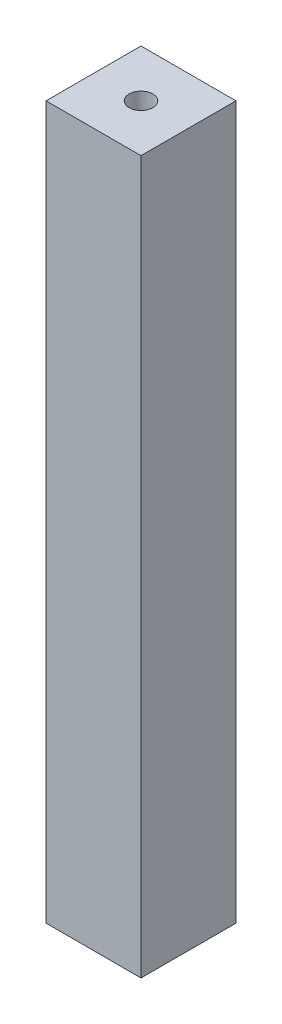
ISO-10303-21;
HEADER;
FILE_DESCRIPTION(('STEP AP214'),'2;1');
FILE_NAME('part.step','',(''),(''),'','','');
FILE_SCHEMA(('AUTOMOTIVE_DESIGN { 1 0 10303 214 1 1 1 1 }'));
ENDSEC;
DATA;
#1=APPLICATION_CONTEXT('core data for automotive mechanical design processes');
#2=APPLICATION_PROTOCOL_DEFINITION('international standard','automotive_design',2000,#1);
#3=PRODUCT_CONTEXT('',#1,'mechanical');
#4=PRODUCT('Part','Part','',(#3));
#5=PRODUCT_RELATED_PRODUCT_CATEGORY('part','',(#4));
#6=PRODUCT_DEFINITION_FORMATION('','',#4);
#7=PRODUCT_DEFINITION_CONTEXT('part definition',#1,'design');
#8=PRODUCT_DEFINITION('design','',#6,#7);
#9=PRODUCT_DEFINITION_SHAPE('','',#8);
#10=(LENGTH_UNIT() NAMED_UNIT(*) SI_UNIT(.MILLI.,.METRE.));
#11=(NAMED_UNIT(*) PLANE_ANGLE_UNIT() SI_UNIT($,.RADIAN.));
#12=(NAMED_UNIT(*) SI_UNIT($,.STERADIAN.) SOLID_ANGLE_UNIT());
#13=UNCERTAINTY_MEASURE_WITH_UNIT(LENGTH_MEASURE(1.E-05),#10,'distance_accuracy_value','');
#14=(GEOMETRIC_REPRESENTATION_CONTEXT(3) GLOBAL_UNCERTAINTY_ASSIGNED_CONTEXT((#13)) GLOBAL_UNIT_ASSIGNED_CONTEXT((#10,
#11,#12)) REPRESENTATION_CONTEXT('',''));
#15=CARTESIAN_POINT('',(0.,0.,0.));
#16=DIRECTION('',(0.,0.,1.));
#17=DIRECTION('',(1.,0.,0.));
#18=AXIS2_PLACEMENT_3D('',#15,#16,#17);
#19=CARTESIAN_POINT('',(-10.,150.,10.));
#20=DIRECTION('',(1.,0.,0.));
#21=DIRECTION('',(0.,0.,-1.));
#22=AXIS2_PLACEMENT_3D('',#19,#20,#21);
#23=PLANE('',#22);
#24=DIRECTION('',(0.,0.,1.));
#25=VECTOR('',#24,1.);
#26=CARTESIAN_POINT('',(-10.,0.,10.));
#27=LINE('',#26,#25);
#28=CARTESIAN_POINT('',(-10.,0.,-10.));
#29=VERTEX_POINT('',#28);
#30=CARTESIAN_POINT('',(-10.,0.,10.));
#31=VERTEX_POINT('',#30);
#32=EDGE_CURVE('E96',#29,#31,#27,.T.);
#33=ORIENTED_EDGE('',*,*,#32,.T.);
#34=DIRECTION('',(0.,-1.,0.));
#35=VECTOR('',#34,1.);
#36=CARTESIAN_POINT('',(-10.,150.,10.));
#37=LINE('',#36,#35);
#38=CARTESIAN_POINT('',(-10.,150.,10.));
#39=VERTEX_POINT('',#38);
#40=EDGE_CURVE('E11',#39,#31,#37,.T.);
#41=ORIENTED_EDGE('',*,*,#40,.F.);
#42=DIRECTION('',(0.,0.,1.));
#43=VECTOR('',#42,1.);
#44=CARTESIAN_POINT('',(-10.,150.,10.));
#45=LINE('',#44,#43);
#46=CARTESIAN_POINT('',(-10.,150.,-10.));
#47=VERTEX_POINT('',#46);
#48=EDGE_CURVE('E84',#47,#39,#45,.T.);
#49=ORIENTED_EDGE('',*,*,#48,.F.);
#50=DIRECTION('',(0.,-1.,0.));
#51=VECTOR('',#50,1.);
#52=CARTESIAN_POINT('',(-10.,150.,-10.));
#53=LINE('',#52,#51);
#54=EDGE_CURVE('E92',#47,#29,#53,.T.);
#55=ORIENTED_EDGE('',*,*,#54,.T.);
#56=EDGE_LOOP('',(#33,#41,#49,#55));
#57=FACE_BOUND('',#56,.T.);
#58=ADVANCED_FACE('F33',(#57),#23,.F.);
#59=CARTESIAN_POINT('',(10.,150.,10.));
#60=DIRECTION('',(0.,0.,-1.));
#61=DIRECTION('',(-1.,0.,0.));
#62=AXIS2_PLACEMENT_3D('',#59,#60,#61);
#63=PLANE('',#62);
#64=DIRECTION('',(1.,0.,0.));
#65=VECTOR('',#64,1.);
#66=CARTESIAN_POINT('',(10.,0.,10.));
#67=LINE('',#66,#65);
#68=CARTESIAN_POINT('',(10.,0.,10.));
#69=VERTEX_POINT('',#68);
#70=EDGE_CURVE('E88',#31,#69,#67,.T.);
#71=ORIENTED_EDGE('',*,*,#70,.T.);
#72=DIRECTION('',(0.,-1.,0.));
#73=VECTOR('',#72,1.);
#74=CARTESIAN_POINT('',(10.,150.,10.));
#75=LINE('',#74,#73);
#76=CARTESIAN_POINT('',(10.,150.,10.));
#77=VERTEX_POINT('',#76);
#78=EDGE_CURVE('E41',#77,#69,#75,.T.);
#79=ORIENTED_EDGE('',*,*,#78,.F.);
#80=DIRECTION('',(1.,0.,0.));
#81=VECTOR('',#80,1.);
#82=CARTESIAN_POINT('',(10.,150.,10.));
#83=LINE('',#82,#81);
#84=EDGE_CURVE('E79',#39,#77,#83,.T.);
#85=ORIENTED_EDGE('',*,*,#84,.F.);
#86=ORIENTED_EDGE('',*,*,#40,.T.);
#87=EDGE_LOOP('',(#71,#79,#85,#86));
#88=FACE_BOUND('',#87,.T.);
#89=ADVANCED_FACE('F87',(#88),#63,.F.);
#90=CARTESIAN_POINT('',(10.,150.,10.));
#91=DIRECTION('',(-1.,0.,0.));
#92=DIRECTION('',(0.,0.,1.));
#93=AXIS2_PLACEMENT_3D('',#90,#91,#92);
#94=PLANE('',#93);
#95=DIRECTION('',(0.,0.,-1.));
#96=VECTOR('',#95,1.);
#97=CARTESIAN_POINT('',(10.,0.,10.));
#98=LINE('',#97,#96);
#99=CARTESIAN_POINT('',(10.,0.,-10.));
#100=VERTEX_POINT('',#99);
#101=EDGE_CURVE('E66',#69,#100,#98,.T.);
#102=ORIENTED_EDGE('',*,*,#101,.T.);
#103=DIRECTION('',(0.,-1.,0.));
#104=VECTOR('',#103,1.);
#105=CARTESIAN_POINT('',(10.,150.,-10.));
#106=LINE('',#105,#104);
#107=CARTESIAN_POINT('',(10.,150.,-10.));
#108=VERTEX_POINT('',#107);
#109=EDGE_CURVE('E89',#108,#100,#106,.T.);
#110=ORIENTED_EDGE('',*,*,#109,.F.);
#111=DIRECTION('',(0.,0.,-1.));
#112=VECTOR('',#111,1.);
#113=CARTESIAN_POINT('',(10.,150.,10.));
#114=LINE('',#113,#112);
#115=EDGE_CURVE('E82',#77,#108,#114,.T.);
#116=ORIENTED_EDGE('',*,*,#115,.F.);
#117=ORIENTED_EDGE('',*,*,#78,.T.);
#118=EDGE_LOOP('',(#102,#110,#116,#117));
#119=FACE_BOUND('',#118,.T.);
#120=ADVANCED_FACE('F90',(#119),#94,.F.);
#121=CARTESIAN_POINT('',(10.,150.,-10.));
#122=DIRECTION('',(0.,0.,1.));
#123=DIRECTION('',(1.,0.,0.));
#124=AXIS2_PLACEMENT_3D('',#121,#122,#123);
#125=PLANE('',#124);
#126=DIRECTION('',(-1.,0.,0.));
#127=VECTOR('',#126,1.);
#128=CARTESIAN_POINT('',(10.,0.,-10.));
#129=LINE('',#128,#127);
#130=EDGE_CURVE('E72',#100,#29,#129,.T.);
#131=ORIENTED_EDGE('',*,*,#130,.T.);
#132=ORIENTED_EDGE('',*,*,#54,.F.);
#133=DIRECTION('',(-1.,0.,0.));
#134=VECTOR('',#133,1.);
#135=CARTESIAN_POINT('',(10.,150.,-10.));
#136=LINE('',#135,#134);
#137=EDGE_CURVE('E49',#108,#47,#136,.T.);
#138=ORIENTED_EDGE('',*,*,#137,.F.);
#139=ORIENTED_EDGE('',*,*,#109,.T.);
#140=EDGE_LOOP('',(#131,#132,#138,#139));
#141=FACE_BOUND('',#140,.T.);
#142=ADVANCED_FACE('F104',(#141),#125,.F.);
#143=CARTESIAN_POINT('',(0.,150.,0.));
#144=DIRECTION('',(0.,1.,0.));
#145=DIRECTION('',(0.,0.,1.));
#146=AXIS2_PLACEMENT_3D('',#143,#144,#145);
#147=PLANE('',#146);
#148=CARTESIAN_POINT('',(0.,150.,0.));
#149=DIRECTION('',(0.,1.,0.));
#150=DIRECTION('',(0.,0.,1.));
#151=AXIS2_PLACEMENT_3D('',#148,#149,#150);
#152=CIRCLE('',#151,2.5);
#153=CARTESIAN_POINT('',(0.,150.,2.5));
#154=VERTEX_POINT('',#153);
#155=EDGE_CURVE('E110',#154,#154,#152,.T.);
#156=ORIENTED_EDGE('',*,*,#155,.F.);
#157=EDGE_LOOP('',(#156));
#158=FACE_BOUND('',#157,.T.);
#159=ORIENTED_EDGE('',*,*,#48,.T.);
#160=ORIENTED_EDGE('',*,*,#84,.T.);
#161=ORIENTED_EDGE('',*,*,#115,.T.);
#162=ORIENTED_EDGE('',*,*,#137,.T.);
#163=EDGE_LOOP('',(#159,#160,#161,#162));
#164=FACE_BOUND('',#163,.T.);
#165=ADVANCED_FACE('F80',(#158,#164),#147,.T.);
#166=CARTESIAN_POINT('',(0.,0.,0.));
#167=DIRECTION('',(0.,1.,0.));
#168=DIRECTION('',(0.,0.,1.));
#169=AXIS2_PLACEMENT_3D('',#166,#167,#168);
#170=PLANE('',#169);
#171=CARTESIAN_POINT('',(0.,0.,0.));
#172=DIRECTION('',(0.,1.,0.));
#173=DIRECTION('',(0.,0.,1.));
#174=AXIS2_PLACEMENT_3D('',#171,#172,#173);
#175=CIRCLE('',#174,2.5);
#176=CARTESIAN_POINT('',(0.,0.,2.5));
#177=VERTEX_POINT('',#176);
#178=EDGE_CURVE('E99',#177,#177,#175,.T.);
#179=ORIENTED_EDGE('',*,*,#178,.T.);
#180=EDGE_LOOP('',(#179));
#181=FACE_BOUND('',#180,.T.);
#182=ORIENTED_EDGE('',*,*,#32,.F.);
#183=ORIENTED_EDGE('',*,*,#130,.F.);
#184=ORIENTED_EDGE('',*,*,#101,.F.);
#185=ORIENTED_EDGE('',*,*,#70,.F.);
#186=EDGE_LOOP('',(#182,#183,#184,#185));
#187=FACE_BOUND('',#186,.T.);
#188=ADVANCED_FACE('F107',(#181,#187),#170,.F.);
#189=CARTESIAN_POINT('',(0.,0.,0.));
#190=DIRECTION('',(0.,1.,0.));
#191=DIRECTION('',(0.,0.,1.));
#192=AXIS2_PLACEMENT_3D('',#189,#190,#191);
#193=CYLINDRICAL_SURFACE('',#192,2.5);
#194=ORIENTED_EDGE('',*,*,#178,.F.);
#195=EDGE_LOOP('',(#194));
#196=FACE_BOUND('',#195,.T.);
#197=ORIENTED_EDGE('',*,*,#155,.T.);
#198=EDGE_LOOP('',(#197));
#199=FACE_BOUND('',#198,.T.);
#200=ADVANCED_FACE('F117',(#196,#199),#193,.F.);
#201=CLOSED_SHELL('',(#58,#89,#120,#142,#165,#188,#200));
#202=MANIFOLD_SOLID_BREP('B2',#201);
#203=ADVANCED_BREP_SHAPE_REPRESENTATION('',(#18,#202),#14);
#204=SHAPE_DEFINITION_REPRESENTATION(#9,#203);
ENDSEC;
END-ISO-10303-21;
